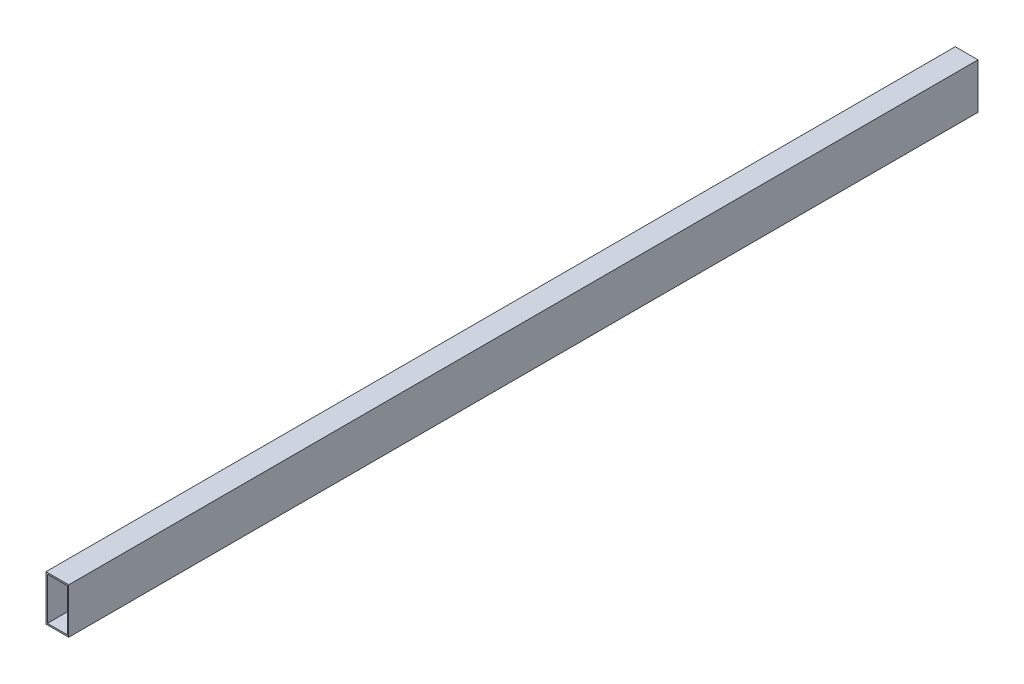
ISO-10303-21;
HEADER;
FILE_DESCRIPTION(('STEP AP214'),'2;1');
FILE_NAME('part.step','',(''),(''),'','','');
FILE_SCHEMA(('AUTOMOTIVE_DESIGN { 1 0 10303 214 1 1 1 1 }'));
ENDSEC;
DATA;
#1=APPLICATION_CONTEXT('core data for automotive mechanical design processes');
#2=APPLICATION_PROTOCOL_DEFINITION('international standard','automotive_design',2000,#1);
#3=PRODUCT_CONTEXT('',#1,'mechanical');
#4=PRODUCT('Part','Part','',(#3));
#5=PRODUCT_RELATED_PRODUCT_CATEGORY('part','',(#4));
#6=PRODUCT_DEFINITION_FORMATION('','',#4);
#7=PRODUCT_DEFINITION_CONTEXT('part definition',#1,'design');
#8=PRODUCT_DEFINITION('design','',#6,#7);
#9=PRODUCT_DEFINITION_SHAPE('','',#8);
#10=(LENGTH_UNIT() NAMED_UNIT(*) SI_UNIT(.MILLI.,.METRE.));
#11=(NAMED_UNIT(*) PLANE_ANGLE_UNIT() SI_UNIT($,.RADIAN.));
#12=(NAMED_UNIT(*) SI_UNIT($,.STERADIAN.) SOLID_ANGLE_UNIT());
#13=UNCERTAINTY_MEASURE_WITH_UNIT(LENGTH_MEASURE(1.E-05),#10,'distance_accuracy_value','');
#14=(GEOMETRIC_REPRESENTATION_CONTEXT(3) GLOBAL_UNCERTAINTY_ASSIGNED_CONTEXT((#13)) GLOBAL_UNIT_ASSIGNED_CONTEXT((#10,
#11,#12)) REPRESENTATION_CONTEXT('',''));
#15=CARTESIAN_POINT('',(0.,0.,0.));
#16=DIRECTION('',(0.,0.,1.));
#17=DIRECTION('',(1.,0.,0.));
#18=AXIS2_PLACEMENT_3D('',#15,#16,#17);
#19=CARTESIAN_POINT('',(0.,0.,1016.));
#20=DIRECTION('',(0.,0.,-1.));
#21=DIRECTION('',(-1.,0.,0.));
#22=AXIS2_PLACEMENT_3D('',#19,#20,#21);
#23=PLANE('',#22);
#24=DIRECTION('',(0.,-1.,0.));
#25=VECTOR('',#24,1.);
#26=CARTESIAN_POINT('',(0.,0.,1016.));
#27=LINE('',#26,#25);
#28=CARTESIAN_POINT('',(0.,50.8,1016.));
#29=VERTEX_POINT('',#28);
#30=CARTESIAN_POINT('',(0.,0.,1016.));
#31=VERTEX_POINT('',#30);
#32=EDGE_CURVE('E133',#29,#31,#27,.T.);
#33=ORIENTED_EDGE('',*,*,#32,.T.);
#34=DIRECTION('',(1.,0.,0.));
#35=VECTOR('',#34,1.);
#36=CARTESIAN_POINT('',(0.,0.,1016.));
#37=LINE('',#36,#35);
#38=CARTESIAN_POINT('',(25.4,0.,1016.));
#39=VERTEX_POINT('',#38);
#40=EDGE_CURVE('E136',#31,#39,#37,.T.);
#41=ORIENTED_EDGE('',*,*,#40,.T.);
#42=DIRECTION('',(0.,1.,0.));
#43=VECTOR('',#42,1.);
#44=CARTESIAN_POINT('',(25.4,0.,1016.));
#45=LINE('',#44,#43);
#46=CARTESIAN_POINT('',(25.4,50.8,1016.));
#47=VERTEX_POINT('',#46);
#48=EDGE_CURVE('E139',#39,#47,#45,.T.);
#49=ORIENTED_EDGE('',*,*,#48,.T.);
#50=DIRECTION('',(-1.,0.,0.));
#51=VECTOR('',#50,1.);
#52=CARTESIAN_POINT('',(0.,50.8,1016.));
#53=LINE('',#52,#51);
#54=EDGE_CURVE('E141',#47,#29,#53,.T.);
#55=ORIENTED_EDGE('',*,*,#54,.T.);
#56=EDGE_LOOP('',(#33,#41,#49,#55));
#57=FACE_BOUND('',#56,.T.);
#58=DIRECTION('',(0.,1.,0.));
#59=VECTOR('',#58,1.);
#60=CARTESIAN_POINT('',(23.8125,49.2125,1016.));
#61=LINE('',#60,#59);
#62=CARTESIAN_POINT('',(23.8125,1.58749999999999,1016.));
#63=VERTEX_POINT('',#62);
#64=CARTESIAN_POINT('',(23.8125,49.2125,1016.));
#65=VERTEX_POINT('',#64);
#66=EDGE_CURVE('E97',#63,#65,#61,.T.);
#67=ORIENTED_EDGE('',*,*,#66,.F.);
#68=DIRECTION('',(1.,0.,0.));
#69=VECTOR('',#68,1.);
#70=CARTESIAN_POINT('',(1.5875,1.58749999999999,1016.));
#71=LINE('',#70,#69);
#72=CARTESIAN_POINT('',(1.5875,1.58749999999999,1016.));
#73=VERTEX_POINT('',#72);
#74=EDGE_CURVE('E119',#73,#63,#71,.T.);
#75=ORIENTED_EDGE('',*,*,#74,.F.);
#76=DIRECTION('',(0.,-1.,0.));
#77=VECTOR('',#76,1.);
#78=CARTESIAN_POINT('',(1.5875,49.2125,1016.));
#79=LINE('',#78,#77);
#80=CARTESIAN_POINT('',(1.5875,49.2125,1016.));
#81=VERTEX_POINT('',#80);
#82=EDGE_CURVE('E117',#81,#73,#79,.T.);
#83=ORIENTED_EDGE('',*,*,#82,.F.);
#84=DIRECTION('',(-1.,0.,0.));
#85=VECTOR('',#84,1.);
#86=CARTESIAN_POINT('',(1.5875,49.2125,1016.));
#87=LINE('',#86,#85);
#88=EDGE_CURVE('E105',#65,#81,#87,.T.);
#89=ORIENTED_EDGE('',*,*,#88,.F.);
#90=EDGE_LOOP('',(#67,#75,#83,#89));
#91=FACE_BOUND('',#90,.T.);
#92=ADVANCED_FACE('F32',(#57,#91),#23,.F.);
#93=CARTESIAN_POINT('',(0.,0.,0.));
#94=DIRECTION('',(0.,0.,-1.));
#95=DIRECTION('',(-1.,0.,0.));
#96=AXIS2_PLACEMENT_3D('',#93,#94,#95);
#97=PLANE('',#96);
#98=DIRECTION('',(0.,-1.,0.));
#99=VECTOR('',#98,1.);
#100=CARTESIAN_POINT('',(0.,0.,0.));
#101=LINE('',#100,#99);
#102=CARTESIAN_POINT('',(0.,50.8,0.));
#103=VERTEX_POINT('',#102);
#104=CARTESIAN_POINT('',(0.,0.,0.));
#105=VERTEX_POINT('',#104);
#106=EDGE_CURVE('E113',#103,#105,#101,.T.);
#107=ORIENTED_EDGE('',*,*,#106,.F.);
#108=DIRECTION('',(-1.,0.,0.));
#109=VECTOR('',#108,1.);
#110=CARTESIAN_POINT('',(0.,50.8,0.));
#111=LINE('',#110,#109);
#112=CARTESIAN_POINT('',(25.4,50.8,0.));
#113=VERTEX_POINT('',#112);
#114=EDGE_CURVE('E137',#113,#103,#111,.T.);
#115=ORIENTED_EDGE('',*,*,#114,.F.);
#116=DIRECTION('',(0.,1.,0.));
#117=VECTOR('',#116,1.);
#118=CARTESIAN_POINT('',(25.4,0.,0.));
#119=LINE('',#118,#117);
#120=CARTESIAN_POINT('',(25.4,0.,0.));
#121=VERTEX_POINT('',#120);
#122=EDGE_CURVE('E148',#121,#113,#119,.T.);
#123=ORIENTED_EDGE('',*,*,#122,.F.);
#124=DIRECTION('',(1.,0.,0.));
#125=VECTOR('',#124,1.);
#126=CARTESIAN_POINT('',(0.,0.,0.));
#127=LINE('',#126,#125);
#128=EDGE_CURVE('E146',#105,#121,#127,.T.);
#129=ORIENTED_EDGE('',*,*,#128,.F.);
#130=EDGE_LOOP('',(#107,#115,#123,#129));
#131=FACE_BOUND('',#130,.T.);
#132=DIRECTION('',(1.,0.,0.));
#133=VECTOR('',#132,1.);
#134=CARTESIAN_POINT('',(1.5875,1.58749999999999,0.));
#135=LINE('',#134,#133);
#136=CARTESIAN_POINT('',(1.5875,1.58749999999999,0.));
#137=VERTEX_POINT('',#136);
#138=CARTESIAN_POINT('',(23.8125,1.58749999999999,0.));
#139=VERTEX_POINT('',#138);
#140=EDGE_CURVE('E106',#137,#139,#135,.T.);
#141=ORIENTED_EDGE('',*,*,#140,.T.);
#142=DIRECTION('',(0.,1.,0.));
#143=VECTOR('',#142,1.);
#144=CARTESIAN_POINT('',(23.8125,49.2125,0.));
#145=LINE('',#144,#143);
#146=CARTESIAN_POINT('',(23.8125,49.2125,0.));
#147=VERTEX_POINT('',#146);
#148=EDGE_CURVE('E55',#139,#147,#145,.T.);
#149=ORIENTED_EDGE('',*,*,#148,.T.);
#150=DIRECTION('',(-1.,0.,0.));
#151=VECTOR('',#150,1.);
#152=CARTESIAN_POINT('',(1.5875,49.2125,0.));
#153=LINE('',#152,#151);
#154=CARTESIAN_POINT('',(1.5875,49.2125,0.));
#155=VERTEX_POINT('',#154);
#156=EDGE_CURVE('E112',#147,#155,#153,.T.);
#157=ORIENTED_EDGE('',*,*,#156,.T.);
#158=DIRECTION('',(0.,-1.,0.));
#159=VECTOR('',#158,1.);
#160=CARTESIAN_POINT('',(1.5875,49.2125,0.));
#161=LINE('',#160,#159);
#162=EDGE_CURVE('E125',#155,#137,#161,.T.);
#163=ORIENTED_EDGE('',*,*,#162,.T.);
#164=EDGE_LOOP('',(#141,#149,#157,#163));
#165=FACE_BOUND('',#164,.T.);
#166=ADVANCED_FACE('F166',(#131,#165),#97,.T.);
#167=CARTESIAN_POINT('',(0.,0.,1016.));
#168=DIRECTION('',(1.,0.,0.));
#169=DIRECTION('',(0.,0.,-1.));
#170=AXIS2_PLACEMENT_3D('',#167,#168,#169);
#171=PLANE('',#170);
#172=ORIENTED_EDGE('',*,*,#106,.T.);
#173=DIRECTION('',(0.,0.,-1.));
#174=VECTOR('',#173,1.);
#175=CARTESIAN_POINT('',(0.,0.,1016.));
#176=LINE('',#175,#174);
#177=EDGE_CURVE('E11',#31,#105,#176,.T.);
#178=ORIENTED_EDGE('',*,*,#177,.F.);
#179=ORIENTED_EDGE('',*,*,#32,.F.);
#180=DIRECTION('',(0.,0.,-1.));
#181=VECTOR('',#180,1.);
#182=CARTESIAN_POINT('',(0.,50.8,1016.));
#183=LINE('',#182,#181);
#184=EDGE_CURVE('E143',#29,#103,#183,.T.);
#185=ORIENTED_EDGE('',*,*,#184,.T.);
#186=EDGE_LOOP('',(#172,#178,#179,#185));
#187=FACE_BOUND('',#186,.T.);
#188=ADVANCED_FACE('F34',(#187),#171,.F.);
#189=CARTESIAN_POINT('',(0.,0.,1016.));
#190=DIRECTION('',(0.,1.,0.));
#191=DIRECTION('',(0.,0.,1.));
#192=AXIS2_PLACEMENT_3D('',#189,#190,#191);
#193=PLANE('',#192);
#194=ORIENTED_EDGE('',*,*,#128,.T.);
#195=DIRECTION('',(0.,0.,-1.));
#196=VECTOR('',#195,1.);
#197=CARTESIAN_POINT('',(25.4,0.,1016.));
#198=LINE('',#197,#196);
#199=EDGE_CURVE('E40',#39,#121,#198,.T.);
#200=ORIENTED_EDGE('',*,*,#199,.F.);
#201=ORIENTED_EDGE('',*,*,#40,.F.);
#202=ORIENTED_EDGE('',*,*,#177,.T.);
#203=EDGE_LOOP('',(#194,#200,#201,#202));
#204=FACE_BOUND('',#203,.T.);
#205=ADVANCED_FACE('F176',(#204),#193,.F.);
#206=CARTESIAN_POINT('',(25.4,0.,1016.));
#207=DIRECTION('',(-1.,0.,0.));
#208=DIRECTION('',(0.,0.,1.));
#209=AXIS2_PLACEMENT_3D('',#206,#207,#208);
#210=PLANE('',#209);
#211=ORIENTED_EDGE('',*,*,#122,.T.);
#212=DIRECTION('',(0.,0.,-1.));
#213=VECTOR('',#212,1.);
#214=CARTESIAN_POINT('',(25.4,50.8,1016.));
#215=LINE('',#214,#213);
#216=EDGE_CURVE('E153',#47,#113,#215,.T.);
#217=ORIENTED_EDGE('',*,*,#216,.F.);
#218=ORIENTED_EDGE('',*,*,#48,.F.);
#219=ORIENTED_EDGE('',*,*,#199,.T.);
#220=EDGE_LOOP('',(#211,#217,#218,#219));
#221=FACE_BOUND('',#220,.T.);
#222=ADVANCED_FACE('F160',(#221),#210,.F.);
#223=CARTESIAN_POINT('',(0.,50.8,1016.));
#224=DIRECTION('',(0.,-1.,0.));
#225=DIRECTION('',(0.,0.,-1.));
#226=AXIS2_PLACEMENT_3D('',#223,#224,#225);
#227=PLANE('',#226);
#228=ORIENTED_EDGE('',*,*,#114,.T.);
#229=ORIENTED_EDGE('',*,*,#184,.F.);
#230=ORIENTED_EDGE('',*,*,#54,.F.);
#231=ORIENTED_EDGE('',*,*,#216,.T.);
#232=EDGE_LOOP('',(#228,#229,#230,#231));
#233=FACE_BOUND('',#232,.T.);
#234=ADVANCED_FACE('F170',(#233),#227,.F.);
#235=CARTESIAN_POINT('',(23.8125,49.2125,1016.));
#236=DIRECTION('',(-1.,0.,0.));
#237=DIRECTION('',(0.,0.,1.));
#238=AXIS2_PLACEMENT_3D('',#235,#236,#237);
#239=PLANE('',#238);
#240=ORIENTED_EDGE('',*,*,#148,.F.);
#241=DIRECTION('',(0.,0.,-1.));
#242=VECTOR('',#241,1.);
#243=CARTESIAN_POINT('',(23.8125,1.58749999999999,1016.));
#244=LINE('',#243,#242);
#245=EDGE_CURVE('E101',#63,#139,#244,.T.);
#246=ORIENTED_EDGE('',*,*,#245,.F.);
#247=ORIENTED_EDGE('',*,*,#66,.T.);
#248=DIRECTION('',(0.,0.,-1.));
#249=VECTOR('',#248,1.);
#250=CARTESIAN_POINT('',(23.8125,49.2125,1016.));
#251=LINE('',#250,#249);
#252=EDGE_CURVE('E100',#65,#147,#251,.T.);
#253=ORIENTED_EDGE('',*,*,#252,.T.);
#254=EDGE_LOOP('',(#240,#246,#247,#253));
#255=FACE_BOUND('',#254,.T.);
#256=ADVANCED_FACE('F99',(#255),#239,.T.);
#257=CARTESIAN_POINT('',(1.5875,49.2125,1016.));
#258=DIRECTION('',(0.,-1.,0.));
#259=DIRECTION('',(0.,0.,-1.));
#260=AXIS2_PLACEMENT_3D('',#257,#258,#259);
#261=PLANE('',#260);
#262=ORIENTED_EDGE('',*,*,#156,.F.);
#263=ORIENTED_EDGE('',*,*,#252,.F.);
#264=ORIENTED_EDGE('',*,*,#88,.T.);
#265=DIRECTION('',(0.,0.,-1.));
#266=VECTOR('',#265,1.);
#267=CARTESIAN_POINT('',(1.5875,49.2125,1016.));
#268=LINE('',#267,#266);
#269=EDGE_CURVE('E114',#81,#155,#268,.T.);
#270=ORIENTED_EDGE('',*,*,#269,.T.);
#271=EDGE_LOOP('',(#262,#263,#264,#270));
#272=FACE_BOUND('',#271,.T.);
#273=ADVANCED_FACE('F109',(#272),#261,.T.);
#274=CARTESIAN_POINT('',(1.5875,49.2125,1016.));
#275=DIRECTION('',(1.,0.,0.));
#276=DIRECTION('',(0.,0.,-1.));
#277=AXIS2_PLACEMENT_3D('',#274,#275,#276);
#278=PLANE('',#277);
#279=ORIENTED_EDGE('',*,*,#162,.F.);
#280=ORIENTED_EDGE('',*,*,#269,.F.);
#281=ORIENTED_EDGE('',*,*,#82,.T.);
#282=DIRECTION('',(0.,0.,-1.));
#283=VECTOR('',#282,1.);
#284=CARTESIAN_POINT('',(1.5875,1.58749999999999,1016.));
#285=LINE('',#284,#283);
#286=EDGE_CURVE('E47',#73,#137,#285,.T.);
#287=ORIENTED_EDGE('',*,*,#286,.T.);
#288=EDGE_LOOP('',(#279,#280,#281,#287));
#289=FACE_BOUND('',#288,.T.);
#290=ADVANCED_FACE('F199',(#289),#278,.T.);
#291=CARTESIAN_POINT('',(1.5875,1.58749999999999,1016.));
#292=DIRECTION('',(0.,1.,0.));
#293=DIRECTION('',(0.,0.,1.));
#294=AXIS2_PLACEMENT_3D('',#291,#292,#293);
#295=PLANE('',#294);
#296=ORIENTED_EDGE('',*,*,#140,.F.);
#297=ORIENTED_EDGE('',*,*,#286,.F.);
#298=ORIENTED_EDGE('',*,*,#74,.T.);
#299=ORIENTED_EDGE('',*,*,#245,.T.);
#300=EDGE_LOOP('',(#296,#297,#298,#299));
#301=FACE_BOUND('',#300,.T.);
#302=ADVANCED_FACE('F203',(#301),#295,.T.);
#303=CLOSED_SHELL('',(#92,#166,#188,#205,#222,#234,#256,#273,#290,#302));
#304=MANIFOLD_SOLID_BREP('B2',#303);
#305=ADVANCED_BREP_SHAPE_REPRESENTATION('',(#18,#304),#14);
#306=SHAPE_DEFINITION_REPRESENTATION(#9,#305);
ENDSEC;
END-ISO-10303-21;
